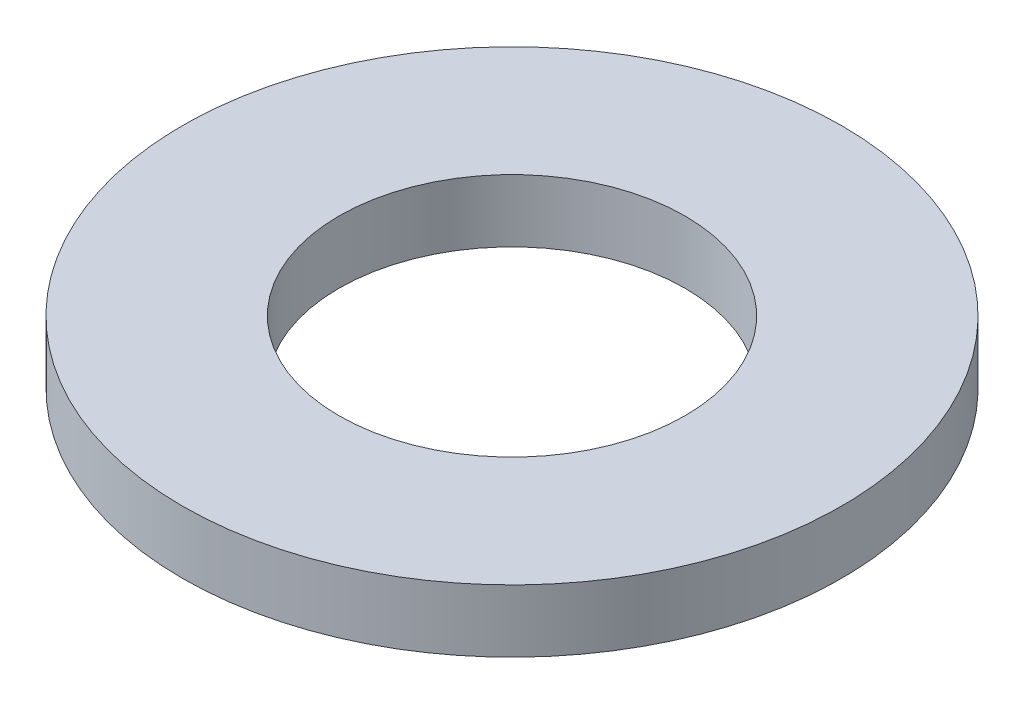
ISO-10303-21;
HEADER;
FILE_DESCRIPTION(('STEP AP214'),'2;1');
FILE_NAME('part.step','',(''),(''),'','','');
FILE_SCHEMA(('AUTOMOTIVE_DESIGN { 1 0 10303 214 1 1 1 1 }'));
ENDSEC;
DATA;
#1=APPLICATION_CONTEXT('core data for automotive mechanical design processes');
#2=APPLICATION_PROTOCOL_DEFINITION('international standard','automotive_design',2000,#1);
#3=PRODUCT_CONTEXT('',#1,'mechanical');
#4=PRODUCT('Part','Part','',(#3));
#5=PRODUCT_RELATED_PRODUCT_CATEGORY('part','',(#4));
#6=PRODUCT_DEFINITION_FORMATION('','',#4);
#7=PRODUCT_DEFINITION_CONTEXT('part definition',#1,'design');
#8=PRODUCT_DEFINITION('design','',#6,#7);
#9=PRODUCT_DEFINITION_SHAPE('','',#8);
#10=(LENGTH_UNIT() NAMED_UNIT(*) SI_UNIT(.MILLI.,.METRE.));
#11=(NAMED_UNIT(*) PLANE_ANGLE_UNIT() SI_UNIT($,.RADIAN.));
#12=(NAMED_UNIT(*) SI_UNIT($,.STERADIAN.) SOLID_ANGLE_UNIT());
#13=UNCERTAINTY_MEASURE_WITH_UNIT(LENGTH_MEASURE(1.E-05),#10,'distance_accuracy_value','');
#14=(GEOMETRIC_REPRESENTATION_CONTEXT(3) GLOBAL_UNCERTAINTY_ASSIGNED_CONTEXT((#13)) GLOBAL_UNIT_ASSIGNED_CONTEXT((#10,
#11,#12)) REPRESENTATION_CONTEXT('',''));
#15=CARTESIAN_POINT('',(0.,0.,0.));
#16=DIRECTION('',(0.,0.,1.));
#17=DIRECTION('',(1.,0.,0.));
#18=AXIS2_PLACEMENT_3D('',#15,#16,#17);
#19=CARTESIAN_POINT('',(0.,0.95,0.));
#20=DIRECTION('',(0.,1.,0.));
#21=DIRECTION('',(0.,0.,1.));
#22=AXIS2_PLACEMENT_3D('',#19,#20,#21);
#23=PLANE('',#22);
#24=CARTESIAN_POINT('',(0.,0.95,0.));
#25=DIRECTION('',(0.,1.,0.));
#26=DIRECTION('',(0.,0.,1.));
#27=AXIS2_PLACEMENT_3D('',#24,#25,#26);
#28=CIRCLE('',#27,10.);
#29=CARTESIAN_POINT('',(0.,0.95,-10.));
#30=VERTEX_POINT('',#29);
#31=EDGE_CURVE('E10',#30,#30,#28,.T.);
#32=ORIENTED_EDGE('',*,*,#31,.T.);
#33=EDGE_LOOP('',(#32));
#34=FACE_BOUND('',#33,.T.);
#35=CARTESIAN_POINT('',(0.,0.95,0.));
#36=DIRECTION('',(0.,1.,0.));
#37=DIRECTION('',(0.,0.,1.));
#38=AXIS2_PLACEMENT_3D('',#35,#36,#37);
#39=CIRCLE('',#38,5.25);
#40=CARTESIAN_POINT('',(0.,0.95,-5.25));
#41=VERTEX_POINT('',#40);
#42=EDGE_CURVE('E50',#41,#41,#39,.T.);
#43=ORIENTED_EDGE('',*,*,#42,.F.);
#44=EDGE_LOOP('',(#43));
#45=FACE_BOUND('',#44,.T.);
#46=ADVANCED_FACE('F39',(#34,#45),#23,.T.);
#47=CARTESIAN_POINT('',(0.,-0.95,0.));
#48=DIRECTION('',(0.,1.,0.));
#49=DIRECTION('',(0.,0.,1.));
#50=AXIS2_PLACEMENT_3D('',#47,#48,#49);
#51=PLANE('',#50);
#52=CARTESIAN_POINT('',(0.,-0.95,0.));
#53=DIRECTION('',(0.,1.,0.));
#54=DIRECTION('',(0.,0.,1.));
#55=AXIS2_PLACEMENT_3D('',#52,#53,#54);
#56=CIRCLE('',#55,10.);
#57=CARTESIAN_POINT('',(0.,-0.95,-10.));
#58=VERTEX_POINT('',#57);
#59=EDGE_CURVE('E43',#58,#58,#56,.T.);
#60=ORIENTED_EDGE('',*,*,#59,.F.);
#61=EDGE_LOOP('',(#60));
#62=FACE_BOUND('',#61,.T.);
#63=CARTESIAN_POINT('',(0.,-0.95,0.));
#64=DIRECTION('',(0.,1.,0.));
#65=DIRECTION('',(0.,0.,1.));
#66=AXIS2_PLACEMENT_3D('',#63,#64,#65);
#67=CIRCLE('',#66,5.25);
#68=CARTESIAN_POINT('',(0.,-0.95,-5.25));
#69=VERTEX_POINT('',#68);
#70=EDGE_CURVE('E52',#69,#69,#67,.T.);
#71=ORIENTED_EDGE('',*,*,#70,.T.);
#72=EDGE_LOOP('',(#71));
#73=FACE_BOUND('',#72,.T.);
#74=ADVANCED_FACE('F62',(#62,#73),#51,.F.);
#75=CARTESIAN_POINT('',(0.,0.95,0.));
#76=DIRECTION('',(0.,-1.,0.));
#77=DIRECTION('',(0.,0.,-1.));
#78=AXIS2_PLACEMENT_3D('',#75,#76,#77);
#79=CYLINDRICAL_SURFACE('',#78,10.);
#80=CARTESIAN_POINT('',(0.,0.95,-10.));
#81=CARTESIAN_POINT('',(0.,0.930208333333333,-10.));
#82=CARTESIAN_POINT('',(0.,0.910416666666667,-10.));
#83=CARTESIAN_POINT('',(0.,0.870833333333333,-10.));
#84=CARTESIAN_POINT('',(0.,0.851041666666667,-10.));
#85=CARTESIAN_POINT('',(0.,0.811458333333333,-10.));
#86=CARTESIAN_POINT('',(0.,0.791666666666667,-10.));
#87=CARTESIAN_POINT('',(0.,0.752083333333333,-10.));
#88=CARTESIAN_POINT('',(0.,0.732291666666667,-10.));
#89=CARTESIAN_POINT('',(0.,0.692708333333333,-10.));
#90=CARTESIAN_POINT('',(0.,0.672916666666667,-10.));
#91=CARTESIAN_POINT('',(0.,0.633333333333333,-10.));
#92=CARTESIAN_POINT('',(0.,0.613541666666667,-10.));
#93=CARTESIAN_POINT('',(0.,0.573958333333333,-10.));
#94=CARTESIAN_POINT('',(0.,0.554166666666667,-10.));
#95=CARTESIAN_POINT('',(0.,0.514583333333333,-10.));
#96=CARTESIAN_POINT('',(0.,0.494791666666667,-10.));
#97=CARTESIAN_POINT('',(0.,0.455208333333333,-10.));
#98=CARTESIAN_POINT('',(0.,0.435416666666667,-10.));
#99=CARTESIAN_POINT('',(0.,0.395833333333333,-10.));
#100=CARTESIAN_POINT('',(0.,0.376041666666667,-10.));
#101=CARTESIAN_POINT('',(0.,0.336458333333333,-10.));
#102=CARTESIAN_POINT('',(0.,0.316666666666667,-10.));
#103=CARTESIAN_POINT('',(0.,0.277083333333333,-10.));
#104=CARTESIAN_POINT('',(0.,0.257291666666667,-10.));
#105=CARTESIAN_POINT('',(0.,0.217708333333333,-10.));
#106=CARTESIAN_POINT('',(0.,0.197916666666667,-10.));
#107=CARTESIAN_POINT('',(0.,0.158333333333333,-10.));
#108=CARTESIAN_POINT('',(0.,0.138541666666667,-10.));
#109=CARTESIAN_POINT('',(0.,0.0989583333333334,-10.));
#110=CARTESIAN_POINT('',(0.,0.0791666666666667,-10.));
#111=CARTESIAN_POINT('',(0.,0.0395833333333333,-10.));
#112=CARTESIAN_POINT('',(0.,0.0197916666666667,-10.));
#113=CARTESIAN_POINT('',(0.,-0.0197916666666666,-10.));
#114=CARTESIAN_POINT('',(0.,-0.0395833333333332,-10.));
#115=CARTESIAN_POINT('',(0.,-0.0791666666666665,-10.));
#116=CARTESIAN_POINT('',(0.,-0.0989583333333332,-10.));
#117=CARTESIAN_POINT('',(0.,-0.138541666666667,-10.));
#118=CARTESIAN_POINT('',(0.,-0.158333333333333,-10.));
#119=CARTESIAN_POINT('',(0.,-0.197916666666667,-10.));
#120=CARTESIAN_POINT('',(0.,-0.217708333333333,-10.));
#121=CARTESIAN_POINT('',(0.,-0.257291666666667,-10.));
#122=CARTESIAN_POINT('',(0.,-0.277083333333333,-10.));
#123=CARTESIAN_POINT('',(0.,-0.316666666666667,-10.));
#124=CARTESIAN_POINT('',(0.,-0.336458333333333,-10.));
#125=CARTESIAN_POINT('',(0.,-0.376041666666667,-10.));
#126=CARTESIAN_POINT('',(0.,-0.395833333333333,-10.));
#127=CARTESIAN_POINT('',(0.,-0.435416666666667,-10.));
#128=CARTESIAN_POINT('',(0.,-0.455208333333333,-10.));
#129=CARTESIAN_POINT('',(0.,-0.494791666666667,-10.));
#130=CARTESIAN_POINT('',(0.,-0.514583333333333,-10.));
#131=CARTESIAN_POINT('',(0.,-0.554166666666667,-10.));
#132=CARTESIAN_POINT('',(0.,-0.573958333333333,-10.));
#133=CARTESIAN_POINT('',(0.,-0.613541666666667,-10.));
#134=CARTESIAN_POINT('',(0.,-0.633333333333333,-10.));
#135=CARTESIAN_POINT('',(0.,-0.672916666666667,-10.));
#136=CARTESIAN_POINT('',(0.,-0.692708333333333,-10.));
#137=CARTESIAN_POINT('',(0.,-0.732291666666667,-10.));
#138=CARTESIAN_POINT('',(0.,-0.752083333333333,-10.));
#139=CARTESIAN_POINT('',(0.,-0.791666666666667,-10.));
#140=CARTESIAN_POINT('',(0.,-0.811458333333333,-10.));
#141=CARTESIAN_POINT('',(0.,-0.851041666666667,-10.));
#142=CARTESIAN_POINT('',(0.,-0.870833333333333,-10.));
#143=CARTESIAN_POINT('',(0.,-0.910416666666667,-10.));
#144=CARTESIAN_POINT('',(0.,-0.930208333333333,-10.));
#145=CARTESIAN_POINT('',(0.,-0.95,-10.));
#146=B_SPLINE_CURVE_WITH_KNOTS('',3,(#80,#81,#82,#83,#84,#85,#86,#87,#88,#89,#90,#91,#92,#93,
#94,#95,#96,#97,#98,#99,#100,#101,#102,#103,#104,#105,#106,#107,#108,#109,#110,#111,#112,#113,
#114,#115,#116,#117,#118,#119,#120,#121,#122,#123,#124,#125,#126,#127,#128,#129,#130,#131,#132,
#133,#134,#135,#136,#137,#138,#139,#140,#141,#142,#143,#144,#145),.UNSPECIFIED.,.F.,.F.,(4,2,2,
2,2,2,2,2,2,2,2,2,2,2,2,2,2,2,2,2,2,2,2,2,2,2,2,2,2,2,2,2,4),(0.,0.0593750000000001,0.11875,
0.178125,0.2375,0.296875,0.35625,0.415625,0.475,0.534375,0.59375,0.653125,0.7125,0.771875,
0.83125,0.890625,0.95,1.009375,1.06875,1.128125,1.1875,1.246875,1.30625,1.365625,1.425,1.484375,
1.54375,1.603125,1.6625,1.721875,1.78125,1.840625,1.9),.UNSPECIFIED.);
#147=EDGE_CURVE('BSEAM41',#30,#58,#146,.T.);
#148=ORIENTED_EDGE('',*,*,#31,.F.);
#149=ORIENTED_EDGE('',*,*,#59,.T.);
#150=ORIENTED_EDGE('',*,*,#147,.T.);
#151=ORIENTED_EDGE('',*,*,#147,.F.);
#152=EDGE_LOOP('',(#148,#150,#149,#151));
#153=FACE_BOUND('',#152,.T.);
#154=ADVANCED_FACE('F41',(#153),#79,.T.);
#155=CARTESIAN_POINT('',(0.,0.95,0.));
#156=DIRECTION('',(0.,-1.,0.));
#157=DIRECTION('',(0.,0.,-1.));
#158=AXIS2_PLACEMENT_3D('',#155,#156,#157);
#159=CYLINDRICAL_SURFACE('',#158,5.25);
#160=CARTESIAN_POINT('',(0.,0.95,-5.25));
#161=CARTESIAN_POINT('',(0.,0.930208333333333,-5.25));
#162=CARTESIAN_POINT('',(0.,0.910416666666667,-5.25));
#163=CARTESIAN_POINT('',(0.,0.870833333333333,-5.25));
#164=CARTESIAN_POINT('',(0.,0.851041666666667,-5.25));
#165=CARTESIAN_POINT('',(0.,0.811458333333333,-5.25));
#166=CARTESIAN_POINT('',(0.,0.791666666666667,-5.25));
#167=CARTESIAN_POINT('',(0.,0.752083333333333,-5.25));
#168=CARTESIAN_POINT('',(0.,0.732291666666667,-5.25));
#169=CARTESIAN_POINT('',(0.,0.692708333333333,-5.25));
#170=CARTESIAN_POINT('',(0.,0.672916666666667,-5.25));
#171=CARTESIAN_POINT('',(0.,0.633333333333333,-5.25));
#172=CARTESIAN_POINT('',(0.,0.613541666666667,-5.25));
#173=CARTESIAN_POINT('',(0.,0.573958333333333,-5.25));
#174=CARTESIAN_POINT('',(0.,0.554166666666667,-5.25));
#175=CARTESIAN_POINT('',(0.,0.514583333333333,-5.25));
#176=CARTESIAN_POINT('',(0.,0.494791666666667,-5.25));
#177=CARTESIAN_POINT('',(0.,0.455208333333333,-5.25));
#178=CARTESIAN_POINT('',(0.,0.435416666666667,-5.25));
#179=CARTESIAN_POINT('',(0.,0.395833333333333,-5.25));
#180=CARTESIAN_POINT('',(0.,0.376041666666667,-5.25));
#181=CARTESIAN_POINT('',(0.,0.336458333333333,-5.25));
#182=CARTESIAN_POINT('',(0.,0.316666666666667,-5.25));
#183=CARTESIAN_POINT('',(0.,0.277083333333333,-5.25));
#184=CARTESIAN_POINT('',(0.,0.257291666666667,-5.25));
#185=CARTESIAN_POINT('',(0.,0.217708333333333,-5.25));
#186=CARTESIAN_POINT('',(0.,0.197916666666667,-5.25));
#187=CARTESIAN_POINT('',(0.,0.158333333333333,-5.25));
#188=CARTESIAN_POINT('',(0.,0.138541666666667,-5.25));
#189=CARTESIAN_POINT('',(0.,0.0989583333333332,-5.25));
#190=CARTESIAN_POINT('',(0.,0.0791666666666666,-5.25));
#191=CARTESIAN_POINT('',(0.,0.0395833333333332,-5.25));
#192=CARTESIAN_POINT('',(0.,0.0197916666666665,-5.25));
#193=CARTESIAN_POINT('',(0.,-0.0197916666666667,-5.25));
#194=CARTESIAN_POINT('',(0.,-0.0395833333333333,-5.25));
#195=CARTESIAN_POINT('',(0.,-0.0791666666666665,-5.25));
#196=CARTESIAN_POINT('',(0.,-0.0989583333333332,-5.25));
#197=CARTESIAN_POINT('',(0.,-0.138541666666667,-5.25));
#198=CARTESIAN_POINT('',(0.,-0.158333333333333,-5.25));
#199=CARTESIAN_POINT('',(0.,-0.197916666666667,-5.25));
#200=CARTESIAN_POINT('',(0.,-0.217708333333333,-5.25));
#201=CARTESIAN_POINT('',(0.,-0.257291666666667,-5.25));
#202=CARTESIAN_POINT('',(0.,-0.277083333333333,-5.25));
#203=CARTESIAN_POINT('',(0.,-0.316666666666667,-5.25));
#204=CARTESIAN_POINT('',(0.,-0.336458333333333,-5.25));
#205=CARTESIAN_POINT('',(0.,-0.376041666666667,-5.25));
#206=CARTESIAN_POINT('',(0.,-0.395833333333333,-5.25));
#207=CARTESIAN_POINT('',(0.,-0.435416666666667,-5.25));
#208=CARTESIAN_POINT('',(0.,-0.455208333333333,-5.25));
#209=CARTESIAN_POINT('',(0.,-0.494791666666667,-5.25));
#210=CARTESIAN_POINT('',(0.,-0.514583333333333,-5.25));
#211=CARTESIAN_POINT('',(0.,-0.554166666666667,-5.25));
#212=CARTESIAN_POINT('',(0.,-0.573958333333333,-5.25));
#213=CARTESIAN_POINT('',(0.,-0.613541666666667,-5.25));
#214=CARTESIAN_POINT('',(0.,-0.633333333333333,-5.25));
#215=CARTESIAN_POINT('',(0.,-0.672916666666667,-5.25));
#216=CARTESIAN_POINT('',(0.,-0.692708333333333,-5.25));
#217=CARTESIAN_POINT('',(0.,-0.732291666666667,-5.25));
#218=CARTESIAN_POINT('',(0.,-0.752083333333333,-5.25));
#219=CARTESIAN_POINT('',(0.,-0.791666666666667,-5.25));
#220=CARTESIAN_POINT('',(0.,-0.811458333333333,-5.25));
#221=CARTESIAN_POINT('',(0.,-0.851041666666667,-5.25));
#222=CARTESIAN_POINT('',(0.,-0.870833333333333,-5.25));
#223=CARTESIAN_POINT('',(0.,-0.910416666666667,-5.25));
#224=CARTESIAN_POINT('',(0.,-0.930208333333333,-5.25));
#225=CARTESIAN_POINT('',(0.,-0.95,-5.25));
#226=B_SPLINE_CURVE_WITH_KNOTS('',3,(#160,#161,#162,#163,#164,#165,#166,#167,#168,#169,#170,
#171,#172,#173,#174,#175,#176,#177,#178,#179,#180,#181,#182,#183,#184,#185,#186,#187,#188,#189,
#190,#191,#192,#193,#194,#195,#196,#197,#198,#199,#200,#201,#202,#203,#204,#205,#206,#207,#208,
#209,#210,#211,#212,#213,#214,#215,#216,#217,#218,#219,#220,#221,#222,#223,#224,#225),
.UNSPECIFIED.,.F.,.F.,(4,2,2,2,2,2,2,2,2,2,2,2,2,2,2,2,2,2,2,2,2,2,2,2,2,2,2,2,2,2,2,2,4),(0.,
0.059375,0.11875,0.178125,0.2375,0.296875,0.35625,0.415625,0.475,0.534375,0.59375,0.653125,
0.7125,0.771875,0.83125,0.890625,0.95,1.009375,1.06875,1.128125,1.1875,1.246875,1.30625,
1.365625,1.425,1.484375,1.54375,1.603125,1.6625,1.721875,1.78125,1.840625,1.9),.UNSPECIFIED.);
#227=EDGE_CURVE('BSEAM58',#41,#69,#226,.T.);
#228=ORIENTED_EDGE('',*,*,#42,.T.);
#229=ORIENTED_EDGE('',*,*,#70,.F.);
#230=ORIENTED_EDGE('',*,*,#227,.T.);
#231=ORIENTED_EDGE('',*,*,#227,.F.);
#232=EDGE_LOOP('',(#228,#230,#229,#231));
#233=FACE_BOUND('',#232,.T.);
#234=ADVANCED_FACE('F58',(#233),#159,.F.);
#235=CLOSED_SHELL('',(#46,#74,#154,#234));
#236=MANIFOLD_SOLID_BREP('B2',#235);
#237=ADVANCED_BREP_SHAPE_REPRESENTATION('',(#18,#236),#14);
#238=SHAPE_DEFINITION_REPRESENTATION(#9,#237);
ENDSEC;
END-ISO-10303-21;
